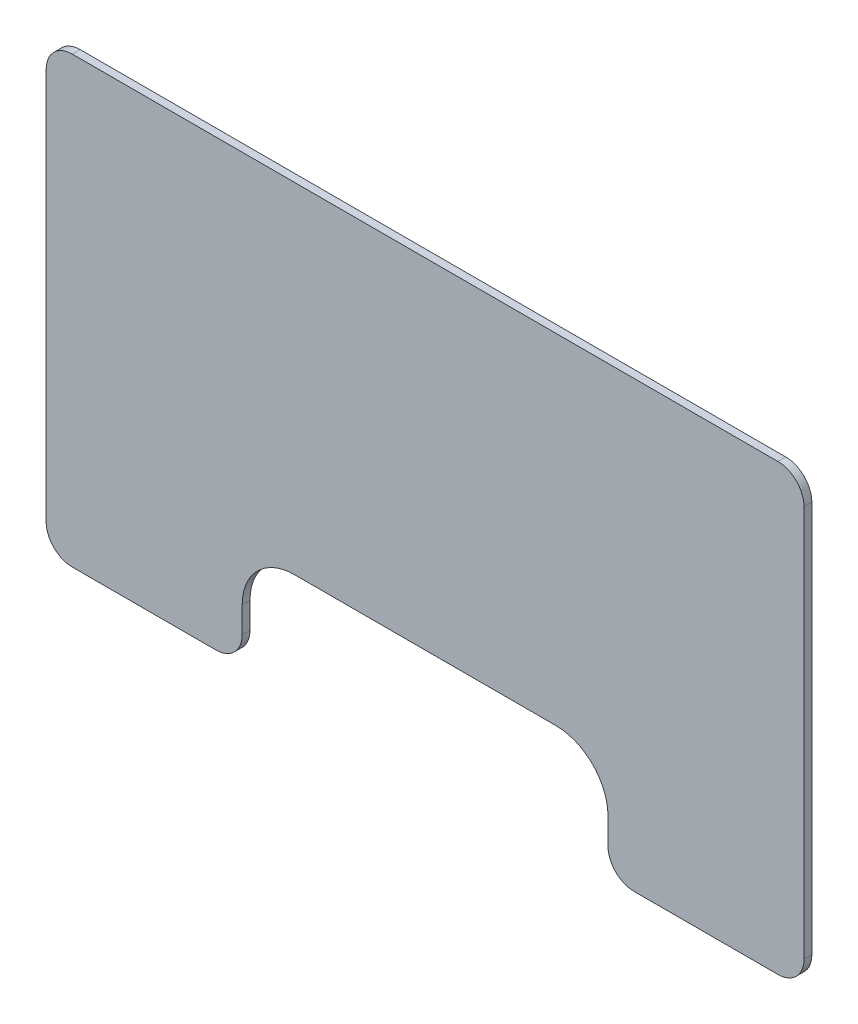
ISO-10303-21;
HEADER;
FILE_DESCRIPTION(('STEP AP214'),'2;1');
FILE_NAME('part.step','',(''),(''),'','','');
FILE_SCHEMA(('AUTOMOTIVE_DESIGN { 1 0 10303 214 1 1 1 1 }'));
ENDSEC;
DATA;
#1=APPLICATION_CONTEXT('core data for automotive mechanical design processes');
#2=APPLICATION_PROTOCOL_DEFINITION('international standard','automotive_design',2000,#1);
#3=PRODUCT_CONTEXT('',#1,'mechanical');
#4=PRODUCT('Part','Part','',(#3));
#5=PRODUCT_RELATED_PRODUCT_CATEGORY('part','',(#4));
#6=PRODUCT_DEFINITION_FORMATION('','',#4);
#7=PRODUCT_DEFINITION_CONTEXT('part definition',#1,'design');
#8=PRODUCT_DEFINITION('design','',#6,#7);
#9=PRODUCT_DEFINITION_SHAPE('','',#8);
#10=(LENGTH_UNIT() NAMED_UNIT(*) SI_UNIT(.MILLI.,.METRE.));
#11=(NAMED_UNIT(*) PLANE_ANGLE_UNIT() SI_UNIT($,.RADIAN.));
#12=(NAMED_UNIT(*) SI_UNIT($,.STERADIAN.) SOLID_ANGLE_UNIT());
#13=UNCERTAINTY_MEASURE_WITH_UNIT(LENGTH_MEASURE(1.E-05),#10,'distance_accuracy_value','');
#14=(GEOMETRIC_REPRESENTATION_CONTEXT(3) GLOBAL_UNCERTAINTY_ASSIGNED_CONTEXT((#13)) GLOBAL_UNIT_ASSIGNED_CONTEXT((#10,
#11,#12)) REPRESENTATION_CONTEXT('',''));
#15=CARTESIAN_POINT('',(0.,0.,0.));
#16=DIRECTION('',(0.,0.,1.));
#17=DIRECTION('',(1.,0.,0.));
#18=AXIS2_PLACEMENT_3D('',#15,#16,#17);
#19=CARTESIAN_POINT('',(-5.,80.,1.5));
#20=DIRECTION('',(0.,0.,-1.));
#21=DIRECTION('',(-1.,0.,0.));
#22=AXIS2_PLACEMENT_3D('',#19,#20,#21);
#23=CYLINDRICAL_SURFACE('',#22,5.);
#24=CARTESIAN_POINT('',(-5.,80.,0.));
#25=DIRECTION('',(0.,0.,1.));
#26=DIRECTION('',(1.,0.,0.));
#27=AXIS2_PLACEMENT_3D('',#24,#25,#26);
#28=CIRCLE('',#27,5.);
#29=CARTESIAN_POINT('',(0.,80.,0.));
#30=VERTEX_POINT('',#29);
#31=CARTESIAN_POINT('',(-5.00000000000004,85.,0.));
#32=VERTEX_POINT('',#31);
#33=EDGE_CURVE('E181',#30,#32,#28,.T.);
#34=ORIENTED_EDGE('',*,*,#33,.T.);
#35=DIRECTION('',(0.,0.,-1.));
#36=VECTOR('',#35,1.);
#37=CARTESIAN_POINT('',(-5.00000000000004,85.,1.5));
#38=LINE('',#37,#36);
#39=CARTESIAN_POINT('',(-5.00000000000004,85.,1.5));
#40=VERTEX_POINT('',#39);
#41=EDGE_CURVE('E11',#40,#32,#38,.T.);
#42=ORIENTED_EDGE('',*,*,#41,.F.);
#43=CARTESIAN_POINT('',(-5.,80.,1.5));
#44=DIRECTION('',(0.,0.,1.));
#45=DIRECTION('',(1.,0.,0.));
#46=AXIS2_PLACEMENT_3D('',#43,#44,#45);
#47=CIRCLE('',#46,5.);
#48=CARTESIAN_POINT('',(0.,80.,1.5));
#49=VERTEX_POINT('',#48);
#50=EDGE_CURVE('E211',#49,#40,#47,.T.);
#51=ORIENTED_EDGE('',*,*,#50,.F.);
#52=DIRECTION('',(0.,0.,-1.));
#53=VECTOR('',#52,1.);
#54=CARTESIAN_POINT('',(0.,80.,1.5));
#55=LINE('',#54,#53);
#56=EDGE_CURVE('E177',#49,#30,#55,.T.);
#57=ORIENTED_EDGE('',*,*,#56,.T.);
#58=EDGE_LOOP('',(#34,#42,#51,#57));
#59=FACE_BOUND('',#58,.T.);
#60=ADVANCED_FACE('F37',(#59),#23,.T.);
#61=CARTESIAN_POINT('',(-5.00000000000004,85.,1.5));
#62=DIRECTION('',(0.,-1.,0.));
#63=DIRECTION('',(1.,0.,0.));
#64=AXIS2_PLACEMENT_3D('',#61,#62,#63);
#65=PLANE('',#64);
#66=DIRECTION('',(-1.,0.,0.));
#67=VECTOR('',#66,1.);
#68=CARTESIAN_POINT('',(-5.00000000000004,85.,0.));
#69=LINE('',#68,#67);
#70=CARTESIAN_POINT('',(-140.,85.,0.));
#71=VERTEX_POINT('',#70);
#72=EDGE_CURVE('E184',#32,#71,#69,.T.);
#73=ORIENTED_EDGE('',*,*,#72,.T.);
#74=DIRECTION('',(0.,0.,-1.));
#75=VECTOR('',#74,1.);
#76=CARTESIAN_POINT('',(-140.,85.,1.5));
#77=LINE('',#76,#75);
#78=CARTESIAN_POINT('',(-140.,85.,1.5));
#79=VERTEX_POINT('',#78);
#80=EDGE_CURVE('E45',#79,#71,#77,.T.);
#81=ORIENTED_EDGE('',*,*,#80,.F.);
#82=DIRECTION('',(-1.,0.,0.));
#83=VECTOR('',#82,1.);
#84=CARTESIAN_POINT('',(-5.00000000000004,85.,1.5));
#85=LINE('',#84,#83);
#86=EDGE_CURVE('E120',#40,#79,#85,.T.);
#87=ORIENTED_EDGE('',*,*,#86,.F.);
#88=ORIENTED_EDGE('',*,*,#41,.T.);
#89=EDGE_LOOP('',(#73,#81,#87,#88));
#90=FACE_BOUND('',#89,.T.);
#91=ADVANCED_FACE('F309',(#90),#65,.F.);
#92=CARTESIAN_POINT('',(-140.,80.,1.5));
#93=DIRECTION('',(0.,0.,-1.));
#94=DIRECTION('',(-1.,0.,0.));
#95=AXIS2_PLACEMENT_3D('',#92,#93,#94);
#96=CYLINDRICAL_SURFACE('',#95,5.);
#97=CARTESIAN_POINT('',(-140.,80.,0.));
#98=DIRECTION('',(0.,0.,1.));
#99=DIRECTION('',(1.,0.,0.));
#100=AXIS2_PLACEMENT_3D('',#97,#98,#99);
#101=CIRCLE('',#100,5.);
#102=CARTESIAN_POINT('',(-145.,80.,0.));
#103=VERTEX_POINT('',#102);
#104=EDGE_CURVE('E186',#71,#103,#101,.T.);
#105=ORIENTED_EDGE('',*,*,#104,.T.);
#106=DIRECTION('',(0.,0.,-1.));
#107=VECTOR('',#106,1.);
#108=CARTESIAN_POINT('',(-145.,80.,1.5));
#109=LINE('',#108,#107);
#110=CARTESIAN_POINT('',(-145.,80.,1.5));
#111=VERTEX_POINT('',#110);
#112=EDGE_CURVE('E242',#111,#103,#109,.T.);
#113=ORIENTED_EDGE('',*,*,#112,.F.);
#114=CARTESIAN_POINT('',(-140.,80.,1.5));
#115=DIRECTION('',(0.,0.,1.));
#116=DIRECTION('',(1.,0.,0.));
#117=AXIS2_PLACEMENT_3D('',#114,#115,#116);
#118=CIRCLE('',#117,5.);
#119=EDGE_CURVE('E250',#79,#111,#118,.T.);
#120=ORIENTED_EDGE('',*,*,#119,.F.);
#121=ORIENTED_EDGE('',*,*,#80,.T.);
#122=EDGE_LOOP('',(#105,#113,#120,#121));
#123=FACE_BOUND('',#122,.T.);
#124=ADVANCED_FACE('F248',(#123),#96,.T.);
#125=CARTESIAN_POINT('',(-145.,5.00000000000004,1.5));
#126=DIRECTION('',(1.,0.,0.));
#127=DIRECTION('',(0.,0.,-1.));
#128=AXIS2_PLACEMENT_3D('',#125,#126,#127);
#129=PLANE('',#128);
#130=DIRECTION('',(0.,-1.,0.));
#131=VECTOR('',#130,1.);
#132=CARTESIAN_POINT('',(-145.,5.00000000000004,0.));
#133=LINE('',#132,#131);
#134=CARTESIAN_POINT('',(-145.,5.,0.));
#135=VERTEX_POINT('',#134);
#136=EDGE_CURVE('E188',#103,#135,#133,.T.);
#137=ORIENTED_EDGE('',*,*,#136,.T.);
#138=DIRECTION('',(0.,0.,-1.));
#139=VECTOR('',#138,1.);
#140=CARTESIAN_POINT('',(-145.,5.,1.5));
#141=LINE('',#140,#139);
#142=CARTESIAN_POINT('',(-145.,5.,1.5));
#143=VERTEX_POINT('',#142);
#144=EDGE_CURVE('E239',#143,#135,#141,.T.);
#145=ORIENTED_EDGE('',*,*,#144,.F.);
#146=DIRECTION('',(0.,-1.,0.));
#147=VECTOR('',#146,1.);
#148=CARTESIAN_POINT('',(-145.,5.00000000000004,1.5));
#149=LINE('',#148,#147);
#150=EDGE_CURVE('E268',#111,#143,#149,.T.);
#151=ORIENTED_EDGE('',*,*,#150,.F.);
#152=ORIENTED_EDGE('',*,*,#112,.T.);
#153=EDGE_LOOP('',(#137,#145,#151,#152));
#154=FACE_BOUND('',#153,.T.);
#155=ADVANCED_FACE('F259',(#154),#129,.F.);
#156=CARTESIAN_POINT('',(-140.,5.,1.5));
#157=DIRECTION('',(0.,0.,-1.));
#158=DIRECTION('',(-1.,0.,0.));
#159=AXIS2_PLACEMENT_3D('',#156,#157,#158);
#160=CYLINDRICAL_SURFACE('',#159,5.);
#161=CARTESIAN_POINT('',(-140.,5.,0.));
#162=DIRECTION('',(0.,0.,1.));
#163=DIRECTION('',(-1.,0.,0.));
#164=AXIS2_PLACEMENT_3D('',#161,#162,#163);
#165=CIRCLE('',#164,5.);
#166=CARTESIAN_POINT('',(-140.,0.,0.));
#167=VERTEX_POINT('',#166);
#168=EDGE_CURVE('E190',#135,#167,#165,.T.);
#169=ORIENTED_EDGE('',*,*,#168,.T.);
#170=DIRECTION('',(0.,0.,-1.));
#171=VECTOR('',#170,1.);
#172=CARTESIAN_POINT('',(-140.,0.,1.5));
#173=LINE('',#172,#171);
#174=CARTESIAN_POINT('',(-140.,0.,1.5));
#175=VERTEX_POINT('',#174);
#176=EDGE_CURVE('E236',#175,#167,#173,.T.);
#177=ORIENTED_EDGE('',*,*,#176,.F.);
#178=CARTESIAN_POINT('',(-140.,5.,1.5));
#179=DIRECTION('',(0.,0.,1.));
#180=DIRECTION('',(-1.,0.,0.));
#181=AXIS2_PLACEMENT_3D('',#178,#179,#180);
#182=CIRCLE('',#181,5.);
#183=EDGE_CURVE('E265',#143,#175,#182,.T.);
#184=ORIENTED_EDGE('',*,*,#183,.F.);
#185=ORIENTED_EDGE('',*,*,#144,.T.);
#186=EDGE_LOOP('',(#169,#177,#184,#185));
#187=FACE_BOUND('',#186,.T.);
#188=ADVANCED_FACE('F263',(#187),#160,.T.);
#189=CARTESIAN_POINT('',(-112.5,0.,1.5));
#190=DIRECTION('',(0.,1.,0.));
#191=DIRECTION('',(0.,0.,1.));
#192=AXIS2_PLACEMENT_3D('',#189,#190,#191);
#193=PLANE('',#192);
#194=DIRECTION('',(1.,0.,0.));
#195=VECTOR('',#194,1.);
#196=CARTESIAN_POINT('',(-112.5,0.,0.));
#197=LINE('',#196,#195);
#198=CARTESIAN_POINT('',(-112.5,0.,0.));
#199=VERTEX_POINT('',#198);
#200=EDGE_CURVE('E192',#167,#199,#197,.T.);
#201=ORIENTED_EDGE('',*,*,#200,.T.);
#202=DIRECTION('',(0.,0.,-1.));
#203=VECTOR('',#202,1.);
#204=CARTESIAN_POINT('',(-112.5,0.,1.5));
#205=LINE('',#204,#203);
#206=CARTESIAN_POINT('',(-112.5,0.,1.5));
#207=VERTEX_POINT('',#206);
#208=EDGE_CURVE('E233',#207,#199,#205,.T.);
#209=ORIENTED_EDGE('',*,*,#208,.F.);
#210=DIRECTION('',(1.,0.,0.));
#211=VECTOR('',#210,1.);
#212=CARTESIAN_POINT('',(-112.5,0.,1.5));
#213=LINE('',#212,#211);
#214=EDGE_CURVE('E267',#175,#207,#213,.T.);
#215=ORIENTED_EDGE('',*,*,#214,.F.);
#216=ORIENTED_EDGE('',*,*,#176,.T.);
#217=EDGE_LOOP('',(#201,#209,#215,#216));
#218=FACE_BOUND('',#217,.T.);
#219=ADVANCED_FACE('F322',(#218),#193,.F.);
#220=CARTESIAN_POINT('',(-112.5,5.,1.5));
#221=DIRECTION('',(0.,0.,-1.));
#222=DIRECTION('',(-1.,0.,0.));
#223=AXIS2_PLACEMENT_3D('',#220,#221,#222);
#224=CYLINDRICAL_SURFACE('',#223,5.);
#225=CARTESIAN_POINT('',(-112.5,5.,0.));
#226=DIRECTION('',(0.,0.,1.));
#227=DIRECTION('',(-1.,0.,0.));
#228=AXIS2_PLACEMENT_3D('',#225,#226,#227);
#229=CIRCLE('',#228,5.);
#230=CARTESIAN_POINT('',(-107.5,5.00000000000004,0.));
#231=VERTEX_POINT('',#230);
#232=EDGE_CURVE('E194',#199,#231,#229,.T.);
#233=ORIENTED_EDGE('',*,*,#232,.T.);
#234=DIRECTION('',(0.,0.,-1.));
#235=VECTOR('',#234,1.);
#236=CARTESIAN_POINT('',(-107.5,5.00000000000004,1.5));
#237=LINE('',#236,#235);
#238=CARTESIAN_POINT('',(-107.5,5.00000000000004,1.5));
#239=VERTEX_POINT('',#238);
#240=EDGE_CURVE('E230',#239,#231,#237,.T.);
#241=ORIENTED_EDGE('',*,*,#240,.F.);
#242=CARTESIAN_POINT('',(-112.5,5.,1.5));
#243=DIRECTION('',(0.,0.,1.));
#244=DIRECTION('',(-1.,0.,0.));
#245=AXIS2_PLACEMENT_3D('',#242,#243,#244);
#246=CIRCLE('',#245,5.);
#247=EDGE_CURVE('E270',#207,#239,#246,.T.);
#248=ORIENTED_EDGE('',*,*,#247,.F.);
#249=ORIENTED_EDGE('',*,*,#208,.T.);
#250=EDGE_LOOP('',(#233,#241,#248,#249));
#251=FACE_BOUND('',#250,.T.);
#252=ADVANCED_FACE('F325',(#251),#224,.T.);
#253=CARTESIAN_POINT('',(-107.5,5.00000000000004,1.5));
#254=DIRECTION('',(-1.,0.,0.));
#255=DIRECTION('',(0.,0.,1.));
#256=AXIS2_PLACEMENT_3D('',#253,#254,#255);
#257=PLANE('',#256);
#258=DIRECTION('',(0.,1.,0.));
#259=VECTOR('',#258,1.);
#260=CARTESIAN_POINT('',(-107.5,5.00000000000004,0.));
#261=LINE('',#260,#259);
#262=CARTESIAN_POINT('',(-107.5,9.99999999999993,0.));
#263=VERTEX_POINT('',#262);
#264=EDGE_CURVE('E196',#231,#263,#261,.T.);
#265=ORIENTED_EDGE('',*,*,#264,.T.);
#266=DIRECTION('',(0.,0.,-1.));
#267=VECTOR('',#266,1.);
#268=CARTESIAN_POINT('',(-107.5,9.99999999999993,1.5));
#269=LINE('',#268,#267);
#270=CARTESIAN_POINT('',(-107.5,9.99999999999993,1.5));
#271=VERTEX_POINT('',#270);
#272=EDGE_CURVE('E227',#271,#263,#269,.T.);
#273=ORIENTED_EDGE('',*,*,#272,.F.);
#274=DIRECTION('',(0.,1.,0.));
#275=VECTOR('',#274,1.);
#276=CARTESIAN_POINT('',(-107.5,5.00000000000004,1.5));
#277=LINE('',#276,#275);
#278=EDGE_CURVE('E276',#239,#271,#277,.T.);
#279=ORIENTED_EDGE('',*,*,#278,.F.);
#280=ORIENTED_EDGE('',*,*,#240,.T.);
#281=EDGE_LOOP('',(#265,#273,#279,#280));
#282=FACE_BOUND('',#281,.T.);
#283=ADVANCED_FACE('F329',(#282),#257,.F.);
#284=CARTESIAN_POINT('',(-97.5,10.,1.5));
#285=DIRECTION('',(0.,0.,-1.));
#286=DIRECTION('',(-1.,0.,0.));
#287=AXIS2_PLACEMENT_3D('',#284,#285,#286);
#288=CYLINDRICAL_SURFACE('',#287,10.);
#289=CARTESIAN_POINT('',(-97.5,10.,0.));
#290=DIRECTION('',(0.,0.,-1.));
#291=DIRECTION('',(-1.,0.,0.));
#292=AXIS2_PLACEMENT_3D('',#289,#290,#291);
#293=CIRCLE('',#292,10.);
#294=CARTESIAN_POINT('',(-97.4999999999999,20.,0.));
#295=VERTEX_POINT('',#294);
#296=EDGE_CURVE('E198',#263,#295,#293,.T.);
#297=ORIENTED_EDGE('',*,*,#296,.T.);
#298=DIRECTION('',(0.,0.,-1.));
#299=VECTOR('',#298,1.);
#300=CARTESIAN_POINT('',(-97.4999999999999,20.,1.5));
#301=LINE('',#300,#299);
#302=CARTESIAN_POINT('',(-97.4999999999999,20.,1.5));
#303=VERTEX_POINT('',#302);
#304=EDGE_CURVE('E224',#303,#295,#301,.T.);
#305=ORIENTED_EDGE('',*,*,#304,.F.);
#306=CARTESIAN_POINT('',(-97.5,10.,1.5));
#307=DIRECTION('',(0.,0.,-1.));
#308=DIRECTION('',(-1.,0.,0.));
#309=AXIS2_PLACEMENT_3D('',#306,#307,#308);
#310=CIRCLE('',#309,10.);
#311=EDGE_CURVE('E278',#271,#303,#310,.T.);
#312=ORIENTED_EDGE('',*,*,#311,.F.);
#313=ORIENTED_EDGE('',*,*,#272,.T.);
#314=EDGE_LOOP('',(#297,#305,#312,#313));
#315=FACE_BOUND('',#314,.T.);
#316=ADVANCED_FACE('F333',(#315),#288,.F.);
#317=CARTESIAN_POINT('',(-97.4999999999999,20.,1.5));
#318=DIRECTION('',(0.,1.,0.));
#319=DIRECTION('',(0.,0.,1.));
#320=AXIS2_PLACEMENT_3D('',#317,#318,#319);
#321=PLANE('',#320);
#322=DIRECTION('',(1.,0.,0.));
#323=VECTOR('',#322,1.);
#324=CARTESIAN_POINT('',(-97.4999999999999,20.,0.));
#325=LINE('',#324,#323);
#326=CARTESIAN_POINT('',(-47.5,20.,0.));
#327=VERTEX_POINT('',#326);
#328=EDGE_CURVE('E200',#295,#327,#325,.T.);
#329=ORIENTED_EDGE('',*,*,#328,.T.);
#330=DIRECTION('',(0.,0.,-1.));
#331=VECTOR('',#330,1.);
#332=CARTESIAN_POINT('',(-47.5,20.,1.5));
#333=LINE('',#332,#331);
#334=CARTESIAN_POINT('',(-47.5,20.,1.5));
#335=VERTEX_POINT('',#334);
#336=EDGE_CURVE('E221',#335,#327,#333,.T.);
#337=ORIENTED_EDGE('',*,*,#336,.F.);
#338=DIRECTION('',(1.,0.,0.));
#339=VECTOR('',#338,1.);
#340=CARTESIAN_POINT('',(-97.4999999999999,20.,1.5));
#341=LINE('',#340,#339);
#342=EDGE_CURVE('E280',#303,#335,#341,.T.);
#343=ORIENTED_EDGE('',*,*,#342,.F.);
#344=ORIENTED_EDGE('',*,*,#304,.T.);
#345=EDGE_LOOP('',(#329,#337,#343,#344));
#346=FACE_BOUND('',#345,.T.);
#347=ADVANCED_FACE('F337',(#346),#321,.F.);
#348=CARTESIAN_POINT('',(-47.5,10.,1.5));
#349=DIRECTION('',(0.,0.,-1.));
#350=DIRECTION('',(-1.,0.,0.));
#351=AXIS2_PLACEMENT_3D('',#348,#349,#350);
#352=CYLINDRICAL_SURFACE('',#351,10.);
#353=CARTESIAN_POINT('',(-47.5,10.,0.));
#354=DIRECTION('',(0.,0.,-1.));
#355=DIRECTION('',(-1.,0.,0.));
#356=AXIS2_PLACEMENT_3D('',#353,#354,#355);
#357=CIRCLE('',#356,10.);
#358=CARTESIAN_POINT('',(-37.5,9.99999999999993,0.));
#359=VERTEX_POINT('',#358);
#360=EDGE_CURVE('E202',#327,#359,#357,.T.);
#361=ORIENTED_EDGE('',*,*,#360,.T.);
#362=DIRECTION('',(0.,0.,-1.));
#363=VECTOR('',#362,1.);
#364=CARTESIAN_POINT('',(-37.5,9.99999999999993,1.5));
#365=LINE('',#364,#363);
#366=CARTESIAN_POINT('',(-37.5,9.99999999999993,1.5));
#367=VERTEX_POINT('',#366);
#368=EDGE_CURVE('E218',#367,#359,#365,.T.);
#369=ORIENTED_EDGE('',*,*,#368,.F.);
#370=CARTESIAN_POINT('',(-47.5,10.,1.5));
#371=DIRECTION('',(0.,0.,-1.));
#372=DIRECTION('',(-1.,0.,0.));
#373=AXIS2_PLACEMENT_3D('',#370,#371,#372);
#374=CIRCLE('',#373,10.);
#375=EDGE_CURVE('E282',#335,#367,#374,.T.);
#376=ORIENTED_EDGE('',*,*,#375,.F.);
#377=ORIENTED_EDGE('',*,*,#336,.T.);
#378=EDGE_LOOP('',(#361,#369,#376,#377));
#379=FACE_BOUND('',#378,.T.);
#380=ADVANCED_FACE('F341',(#379),#352,.F.);
#381=CARTESIAN_POINT('',(-37.5,5.00000000000003,1.5));
#382=DIRECTION('',(1.,0.,0.));
#383=DIRECTION('',(0.,0.,-1.));
#384=AXIS2_PLACEMENT_3D('',#381,#382,#383);
#385=PLANE('',#384);
#386=DIRECTION('',(0.,-1.,0.));
#387=VECTOR('',#386,1.);
#388=CARTESIAN_POINT('',(-37.5,5.00000000000003,0.));
#389=LINE('',#388,#387);
#390=CARTESIAN_POINT('',(-37.5,5.,0.));
#391=VERTEX_POINT('',#390);
#392=EDGE_CURVE('E204',#359,#391,#389,.T.);
#393=ORIENTED_EDGE('',*,*,#392,.T.);
#394=DIRECTION('',(0.,0.,-1.));
#395=VECTOR('',#394,1.);
#396=CARTESIAN_POINT('',(-37.5,5.,1.5));
#397=LINE('',#396,#395);
#398=CARTESIAN_POINT('',(-37.5,5.,1.5));
#399=VERTEX_POINT('',#398);
#400=EDGE_CURVE('E215',#399,#391,#397,.T.);
#401=ORIENTED_EDGE('',*,*,#400,.F.);
#402=DIRECTION('',(0.,-1.,0.));
#403=VECTOR('',#402,1.);
#404=CARTESIAN_POINT('',(-37.5,5.00000000000003,1.5));
#405=LINE('',#404,#403);
#406=EDGE_CURVE('E284',#367,#399,#405,.T.);
#407=ORIENTED_EDGE('',*,*,#406,.F.);
#408=ORIENTED_EDGE('',*,*,#368,.T.);
#409=EDGE_LOOP('',(#393,#401,#407,#408));
#410=FACE_BOUND('',#409,.T.);
#411=ADVANCED_FACE('F290',(#410),#385,.F.);
#412=CARTESIAN_POINT('',(-32.5,5.,1.5));
#413=DIRECTION('',(0.,0.,-1.));
#414=DIRECTION('',(-1.,0.,0.));
#415=AXIS2_PLACEMENT_3D('',#412,#413,#414);
#416=CYLINDRICAL_SURFACE('',#415,5.);
#417=CARTESIAN_POINT('',(-32.5,5.,0.));
#418=DIRECTION('',(0.,0.,1.));
#419=DIRECTION('',(-1.,0.,0.));
#420=AXIS2_PLACEMENT_3D('',#417,#418,#419);
#421=CIRCLE('',#420,5.);
#422=CARTESIAN_POINT('',(-32.4999999999999,0.,0.));
#423=VERTEX_POINT('',#422);
#424=EDGE_CURVE('E206',#391,#423,#421,.T.);
#425=ORIENTED_EDGE('',*,*,#424,.T.);
#426=DIRECTION('',(0.,0.,-1.));
#427=VECTOR('',#426,1.);
#428=CARTESIAN_POINT('',(-32.4999999999999,0.,1.5));
#429=LINE('',#428,#427);
#430=CARTESIAN_POINT('',(-32.4999999999999,0.,1.5));
#431=VERTEX_POINT('',#430);
#432=EDGE_CURVE('E172',#431,#423,#429,.T.);
#433=ORIENTED_EDGE('',*,*,#432,.F.);
#434=CARTESIAN_POINT('',(-32.5,5.,1.5));
#435=DIRECTION('',(0.,0.,1.));
#436=DIRECTION('',(-1.,0.,0.));
#437=AXIS2_PLACEMENT_3D('',#434,#435,#436);
#438=CIRCLE('',#437,5.);
#439=EDGE_CURVE('E163',#399,#431,#438,.T.);
#440=ORIENTED_EDGE('',*,*,#439,.F.);
#441=ORIENTED_EDGE('',*,*,#400,.T.);
#442=EDGE_LOOP('',(#425,#433,#440,#441));
#443=FACE_BOUND('',#442,.T.);
#444=ADVANCED_FACE('F294',(#443),#416,.T.);
#445=CARTESIAN_POINT('',(-5.00000000000004,0.,1.5));
#446=DIRECTION('',(0.,1.,0.));
#447=DIRECTION('',(0.,0.,1.));
#448=AXIS2_PLACEMENT_3D('',#445,#446,#447);
#449=PLANE('',#448);
#450=DIRECTION('',(1.,0.,0.));
#451=VECTOR('',#450,1.);
#452=CARTESIAN_POINT('',(-5.00000000000004,0.,0.));
#453=LINE('',#452,#451);
#454=CARTESIAN_POINT('',(-5.00000000000004,0.,0.));
#455=VERTEX_POINT('',#454);
#456=EDGE_CURVE('E171',#423,#455,#453,.T.);
#457=ORIENTED_EDGE('',*,*,#456,.T.);
#458=DIRECTION('',(0.,0.,-1.));
#459=VECTOR('',#458,1.);
#460=CARTESIAN_POINT('',(-5.00000000000004,0.,1.5));
#461=LINE('',#460,#459);
#462=CARTESIAN_POINT('',(-5.00000000000004,0.,1.5));
#463=VERTEX_POINT('',#462);
#464=EDGE_CURVE('E168',#463,#455,#461,.T.);
#465=ORIENTED_EDGE('',*,*,#464,.F.);
#466=DIRECTION('',(1.,0.,0.));
#467=VECTOR('',#466,1.);
#468=CARTESIAN_POINT('',(-5.00000000000004,0.,1.5));
#469=LINE('',#468,#467);
#470=EDGE_CURVE('E157',#431,#463,#469,.T.);
#471=ORIENTED_EDGE('',*,*,#470,.F.);
#472=ORIENTED_EDGE('',*,*,#432,.T.);
#473=EDGE_LOOP('',(#457,#465,#471,#472));
#474=FACE_BOUND('',#473,.T.);
#475=ADVANCED_FACE('F169',(#474),#449,.F.);
#476=CARTESIAN_POINT('',(-5.,5.,1.5));
#477=DIRECTION('',(0.,0.,-1.));
#478=DIRECTION('',(-1.,0.,0.));
#479=AXIS2_PLACEMENT_3D('',#476,#477,#478);
#480=CYLINDRICAL_SURFACE('',#479,5.);
#481=CARTESIAN_POINT('',(-5.,5.,0.));
#482=DIRECTION('',(0.,0.,1.));
#483=DIRECTION('',(1.,0.,0.));
#484=AXIS2_PLACEMENT_3D('',#481,#482,#483);
#485=CIRCLE('',#484,5.);
#486=CARTESIAN_POINT('',(0.,5.00000000000004,0.));
#487=VERTEX_POINT('',#486);
#488=EDGE_CURVE('E106',#455,#487,#485,.T.);
#489=ORIENTED_EDGE('',*,*,#488,.T.);
#490=DIRECTION('',(0.,0.,-1.));
#491=VECTOR('',#490,1.);
#492=CARTESIAN_POINT('',(0.,5.00000000000004,1.5));
#493=LINE('',#492,#491);
#494=CARTESIAN_POINT('',(0.,5.00000000000004,1.5));
#495=VERTEX_POINT('',#494);
#496=EDGE_CURVE('E173',#495,#487,#493,.T.);
#497=ORIENTED_EDGE('',*,*,#496,.F.);
#498=CARTESIAN_POINT('',(-5.,5.,1.5));
#499=DIRECTION('',(0.,0.,1.));
#500=DIRECTION('',(1.,0.,0.));
#501=AXIS2_PLACEMENT_3D('',#498,#499,#500);
#502=CIRCLE('',#501,5.);
#503=EDGE_CURVE('E161',#463,#495,#502,.T.);
#504=ORIENTED_EDGE('',*,*,#503,.F.);
#505=ORIENTED_EDGE('',*,*,#464,.T.);
#506=EDGE_LOOP('',(#489,#497,#504,#505));
#507=FACE_BOUND('',#506,.T.);
#508=ADVANCED_FACE('F175',(#507),#480,.T.);
#509=CARTESIAN_POINT('',(0.,5.00000000000004,1.5));
#510=DIRECTION('',(-1.,0.,0.));
#511=DIRECTION('',(0.,0.,1.));
#512=AXIS2_PLACEMENT_3D('',#509,#510,#511);
#513=PLANE('',#512);
#514=DIRECTION('',(0.,1.,0.));
#515=VECTOR('',#514,1.);
#516=CARTESIAN_POINT('',(0.,5.00000000000004,0.));
#517=LINE('',#516,#515);
#518=EDGE_CURVE('E112',#487,#30,#517,.T.);
#519=ORIENTED_EDGE('',*,*,#518,.T.);
#520=ORIENTED_EDGE('',*,*,#56,.F.);
#521=DIRECTION('',(0.,1.,0.));
#522=VECTOR('',#521,1.);
#523=CARTESIAN_POINT('',(0.,5.00000000000004,1.5));
#524=LINE('',#523,#522);
#525=EDGE_CURVE('E53',#495,#49,#524,.T.);
#526=ORIENTED_EDGE('',*,*,#525,.F.);
#527=ORIENTED_EDGE('',*,*,#496,.T.);
#528=EDGE_LOOP('',(#519,#520,#526,#527));
#529=FACE_BOUND('',#528,.T.);
#530=ADVANCED_FACE('F298',(#529),#513,.F.);
#531=CARTESIAN_POINT('',(-5.,80.,1.5));
#532=DIRECTION('',(0.,0.,1.));
#533=DIRECTION('',(1.,0.,0.));
#534=AXIS2_PLACEMENT_3D('',#531,#532,#533);
#535=PLANE('',#534);
#536=ORIENTED_EDGE('',*,*,#50,.T.);
#537=ORIENTED_EDGE('',*,*,#86,.T.);
#538=ORIENTED_EDGE('',*,*,#119,.T.);
#539=ORIENTED_EDGE('',*,*,#150,.T.);
#540=ORIENTED_EDGE('',*,*,#183,.T.);
#541=ORIENTED_EDGE('',*,*,#214,.T.);
#542=ORIENTED_EDGE('',*,*,#247,.T.);
#543=ORIENTED_EDGE('',*,*,#278,.T.);
#544=ORIENTED_EDGE('',*,*,#311,.T.);
#545=ORIENTED_EDGE('',*,*,#342,.T.);
#546=ORIENTED_EDGE('',*,*,#375,.T.);
#547=ORIENTED_EDGE('',*,*,#406,.T.);
#548=ORIENTED_EDGE('',*,*,#439,.T.);
#549=ORIENTED_EDGE('',*,*,#470,.T.);
#550=ORIENTED_EDGE('',*,*,#503,.T.);
#551=ORIENTED_EDGE('',*,*,#525,.T.);
#552=EDGE_LOOP('',(#536,#537,#538,#539,#540,#541,#542,#543,#544,#545,#546,#547,#548,#549,#550,#551));
#553=FACE_BOUND('',#552,.T.);
#554=ADVANCED_FACE('F159',(#553),#535,.T.);
#555=CARTESIAN_POINT('',(-5.,80.,0.));
#556=DIRECTION('',(0.,0.,1.));
#557=DIRECTION('',(1.,0.,0.));
#558=AXIS2_PLACEMENT_3D('',#555,#556,#557);
#559=PLANE('',#558);
#560=ORIENTED_EDGE('',*,*,#33,.F.);
#561=ORIENTED_EDGE('',*,*,#518,.F.);
#562=ORIENTED_EDGE('',*,*,#488,.F.);
#563=ORIENTED_EDGE('',*,*,#456,.F.);
#564=ORIENTED_EDGE('',*,*,#424,.F.);
#565=ORIENTED_EDGE('',*,*,#392,.F.);
#566=ORIENTED_EDGE('',*,*,#360,.F.);
#567=ORIENTED_EDGE('',*,*,#328,.F.);
#568=ORIENTED_EDGE('',*,*,#296,.F.);
#569=ORIENTED_EDGE('',*,*,#264,.F.);
#570=ORIENTED_EDGE('',*,*,#232,.F.);
#571=ORIENTED_EDGE('',*,*,#200,.F.);
#572=ORIENTED_EDGE('',*,*,#168,.F.);
#573=ORIENTED_EDGE('',*,*,#136,.F.);
#574=ORIENTED_EDGE('',*,*,#104,.F.);
#575=ORIENTED_EDGE('',*,*,#72,.F.);
#576=EDGE_LOOP('',(#560,#561,#562,#563,#564,#565,#566,#567,#568,#569,#570,#571,#572,#573,#574,#575));
#577=FACE_BOUND('',#576,.T.);
#578=ADVANCED_FACE('F254',(#577),#559,.F.);
#579=CLOSED_SHELL('',(#60,#91,#124,#155,#188,#219,#252,#283,#316,#347,#380,#411,#444,#475,#508,
#530,#554,#578));
#580=MANIFOLD_SOLID_BREP('B2',#579);
#581=ADVANCED_BREP_SHAPE_REPRESENTATION('',(#18,#580),#14);
#582=SHAPE_DEFINITION_REPRESENTATION(#9,#581);
ENDSEC;
END-ISO-10303-21;
